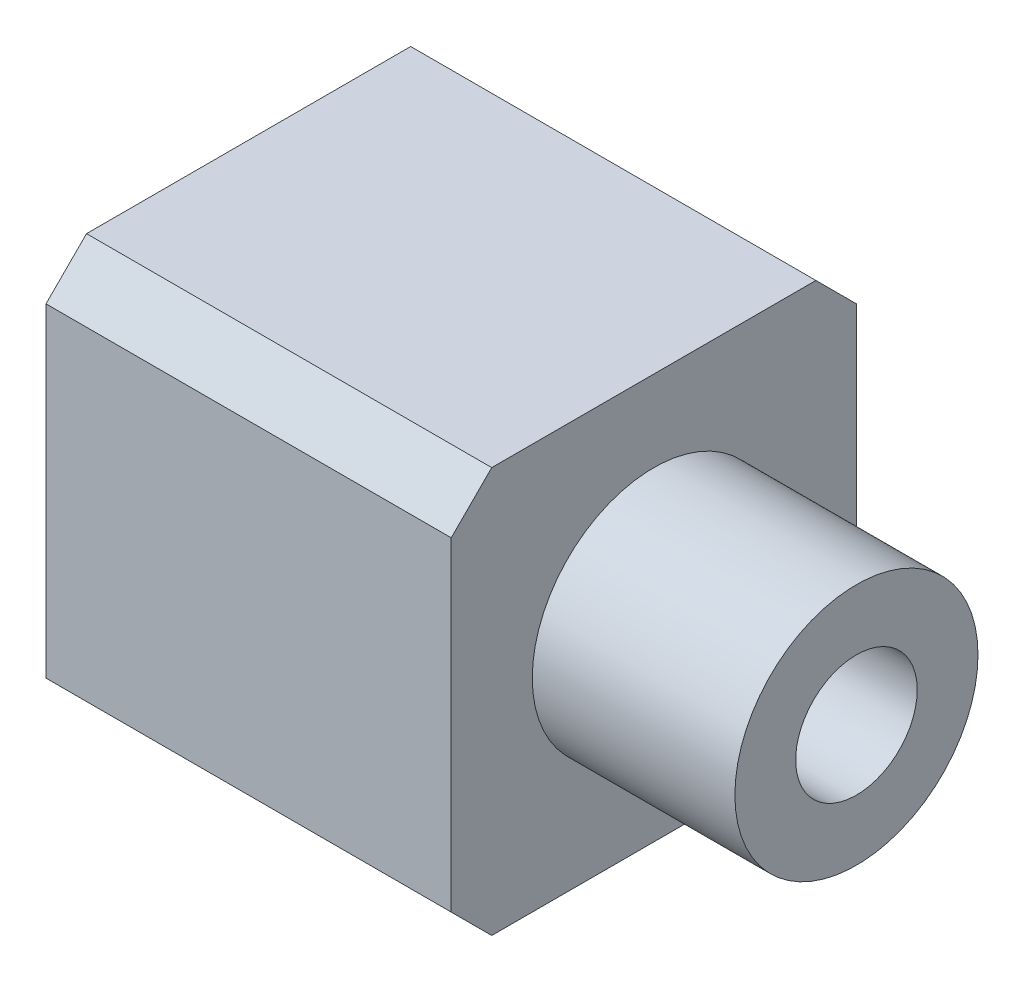
ISO-10303-21;
HEADER;
FILE_DESCRIPTION(('STEP AP214'),'2;1');
FILE_NAME('part.step','',(''),(''),'','','');
FILE_SCHEMA(('AUTOMOTIVE_DESIGN { 1 0 10303 214 1 1 1 1 }'));
ENDSEC;
DATA;
#1=APPLICATION_CONTEXT('core data for automotive mechanical design processes');
#2=APPLICATION_PROTOCOL_DEFINITION('international standard','automotive_design',2000,#1);
#3=PRODUCT_CONTEXT('',#1,'mechanical');
#4=PRODUCT('Part','Part','',(#3));
#5=PRODUCT_RELATED_PRODUCT_CATEGORY('part','',(#4));
#6=PRODUCT_DEFINITION_FORMATION('','',#4);
#7=PRODUCT_DEFINITION_CONTEXT('part definition',#1,'design');
#8=PRODUCT_DEFINITION('design','',#6,#7);
#9=PRODUCT_DEFINITION_SHAPE('','',#8);
#10=(LENGTH_UNIT() NAMED_UNIT(*) SI_UNIT(.MILLI.,.METRE.));
#11=(NAMED_UNIT(*) PLANE_ANGLE_UNIT() SI_UNIT($,.RADIAN.));
#12=(NAMED_UNIT(*) SI_UNIT($,.STERADIAN.) SOLID_ANGLE_UNIT());
#13=UNCERTAINTY_MEASURE_WITH_UNIT(LENGTH_MEASURE(1.E-05),#10,'distance_accuracy_value','');
#14=(GEOMETRIC_REPRESENTATION_CONTEXT(3) GLOBAL_UNCERTAINTY_ASSIGNED_CONTEXT((#13)) GLOBAL_UNIT_ASSIGNED_CONTEXT((#10,
#11,#12)) REPRESENTATION_CONTEXT('',''));
#15=CARTESIAN_POINT('',(0.,0.,0.));
#16=DIRECTION('',(0.,0.,1.));
#17=DIRECTION('',(1.,0.,0.));
#18=AXIS2_PLACEMENT_3D('',#15,#16,#17);
#19=CARTESIAN_POINT('',(-17.,-5.,5.));
#20=DIRECTION('',(0.,0.,1.));
#21=DIRECTION('',(1.,0.,0.));
#22=AXIS2_PLACEMENT_3D('',#19,#20,#21);
#23=PLANE('',#22);
#24=DIRECTION('',(0.,1.,0.));
#25=VECTOR('',#24,1.);
#26=CARTESIAN_POINT('',(-5.,-5.,5.));
#27=LINE('',#26,#25);
#28=CARTESIAN_POINT('',(-5.,-4.,5.));
#29=VERTEX_POINT('',#28);
#30=CARTESIAN_POINT('',(-5.,4.,5.));
#31=VERTEX_POINT('',#30);
#32=EDGE_CURVE('E131',#29,#31,#27,.T.);
#33=ORIENTED_EDGE('',*,*,#32,.T.);
#34=DIRECTION('',(-1.,0.,0.));
#35=VECTOR('',#34,1.);
#36=CARTESIAN_POINT('',(-17.,4.,5.));
#37=LINE('',#36,#35);
#38=CARTESIAN_POINT('',(-15.,4.,5.));
#39=VERTEX_POINT('',#38);
#40=EDGE_CURVE('E11',#31,#39,#37,.T.);
#41=ORIENTED_EDGE('',*,*,#40,.T.);
#42=DIRECTION('',(0.,-1.,0.));
#43=VECTOR('',#42,1.);
#44=CARTESIAN_POINT('',(-15.,-5.,5.));
#45=LINE('',#44,#43);
#46=CARTESIAN_POINT('',(-15.,-4.,5.));
#47=VERTEX_POINT('',#46);
#48=EDGE_CURVE('E132',#39,#47,#45,.T.);
#49=ORIENTED_EDGE('',*,*,#48,.T.);
#50=DIRECTION('',(1.,0.,0.));
#51=VECTOR('',#50,1.);
#52=CARTESIAN_POINT('',(-17.,-4.,5.));
#53=LINE('',#52,#51);
#54=EDGE_CURVE('E40',#47,#29,#53,.T.);
#55=ORIENTED_EDGE('',*,*,#54,.T.);
#56=EDGE_LOOP('',(#33,#41,#49,#55));
#57=FACE_BOUND('',#56,.T.);
#58=ADVANCED_FACE('F32',(#57),#23,.T.);
#59=CARTESIAN_POINT('',(-17.,5.,-5.));
#60=DIRECTION('',(0.,1.,0.));
#61=DIRECTION('',(0.,0.,1.));
#62=AXIS2_PLACEMENT_3D('',#59,#60,#61);
#63=PLANE('',#62);
#64=DIRECTION('',(0.,0.,1.));
#65=VECTOR('',#64,1.);
#66=CARTESIAN_POINT('',(-15.,5.,-5.));
#67=LINE('',#66,#65);
#68=CARTESIAN_POINT('',(-15.,5.,-4.));
#69=VERTEX_POINT('',#68);
#70=CARTESIAN_POINT('',(-15.,5.,4.));
#71=VERTEX_POINT('',#70);
#72=EDGE_CURVE('E167',#69,#71,#67,.T.);
#73=ORIENTED_EDGE('',*,*,#72,.T.);
#74=DIRECTION('',(1.,0.,0.));
#75=VECTOR('',#74,1.);
#76=CARTESIAN_POINT('',(-17.,5.,4.));
#77=LINE('',#76,#75);
#78=CARTESIAN_POINT('',(-5.,5.,4.));
#79=VERTEX_POINT('',#78);
#80=EDGE_CURVE('E128',#71,#79,#77,.T.);
#81=ORIENTED_EDGE('',*,*,#80,.T.);
#82=DIRECTION('',(0.,0.,-1.));
#83=VECTOR('',#82,1.);
#84=CARTESIAN_POINT('',(-5.,5.,-5.));
#85=LINE('',#84,#83);
#86=CARTESIAN_POINT('',(-5.,5.,-4.));
#87=VERTEX_POINT('',#86);
#88=EDGE_CURVE('E139',#79,#87,#85,.T.);
#89=ORIENTED_EDGE('',*,*,#88,.T.);
#90=DIRECTION('',(-1.,0.,0.));
#91=VECTOR('',#90,1.);
#92=CARTESIAN_POINT('',(-17.,5.,-4.));
#93=LINE('',#92,#91);
#94=EDGE_CURVE('E126',#87,#69,#93,.T.);
#95=ORIENTED_EDGE('',*,*,#94,.T.);
#96=EDGE_LOOP('',(#73,#81,#89,#95));
#97=FACE_BOUND('',#96,.T.);
#98=ADVANCED_FACE('F208',(#97),#63,.T.);
#99=CARTESIAN_POINT('',(-17.,-5.,-5.));
#100=DIRECTION('',(0.,0.,-1.));
#101=DIRECTION('',(-1.,0.,0.));
#102=AXIS2_PLACEMENT_3D('',#99,#100,#101);
#103=PLANE('',#102);
#104=CARTESIAN_POINT('',(-10.,0.,-5.));
#105=DIRECTION('',(0.,0.,-1.));
#106=DIRECTION('',(-1.,0.,0.));
#107=AXIS2_PLACEMENT_3D('',#104,#105,#106);
#108=CIRCLE('',#107,1.5);
#109=CARTESIAN_POINT('',(-11.5,0.,-5.));
#110=VERTEX_POINT('',#109);
#111=EDGE_CURVE('E193',#110,#110,#108,.T.);
#112=ORIENTED_EDGE('',*,*,#111,.F.);
#113=EDGE_LOOP('',(#112));
#114=FACE_BOUND('',#113,.T.);
#115=DIRECTION('',(0.,-1.,0.));
#116=VECTOR('',#115,1.);
#117=CARTESIAN_POINT('',(-5.,-5.,-5.));
#118=LINE('',#117,#116);
#119=CARTESIAN_POINT('',(-5.,4.00000000000001,-5.));
#120=VERTEX_POINT('',#119);
#121=CARTESIAN_POINT('',(-5.,-4.,-5.));
#122=VERTEX_POINT('',#121);
#123=EDGE_CURVE('E143',#120,#122,#118,.T.);
#124=ORIENTED_EDGE('',*,*,#123,.T.);
#125=DIRECTION('',(-1.,0.,0.));
#126=VECTOR('',#125,1.);
#127=CARTESIAN_POINT('',(-17.,-4.,-5.));
#128=LINE('',#127,#126);
#129=CARTESIAN_POINT('',(-15.,-4.,-5.));
#130=VERTEX_POINT('',#129);
#131=EDGE_CURVE('E121',#122,#130,#128,.T.);
#132=ORIENTED_EDGE('',*,*,#131,.T.);
#133=DIRECTION('',(0.,1.,0.));
#134=VECTOR('',#133,1.);
#135=CARTESIAN_POINT('',(-15.,-5.,-5.));
#136=LINE('',#135,#134);
#137=CARTESIAN_POINT('',(-15.,4.00000000000001,-5.));
#138=VERTEX_POINT('',#137);
#139=EDGE_CURVE('E161',#130,#138,#136,.T.);
#140=ORIENTED_EDGE('',*,*,#139,.T.);
#141=DIRECTION('',(1.,0.,0.));
#142=VECTOR('',#141,1.);
#143=CARTESIAN_POINT('',(-17.,4.00000000000001,-5.));
#144=LINE('',#143,#142);
#145=EDGE_CURVE('E154',#138,#120,#144,.T.);
#146=ORIENTED_EDGE('',*,*,#145,.T.);
#147=EDGE_LOOP('',(#124,#132,#140,#146));
#148=FACE_BOUND('',#147,.T.);
#149=ADVANCED_FACE('F160',(#114,#148),#103,.T.);
#150=CARTESIAN_POINT('',(-17.,-5.,-5.));
#151=DIRECTION('',(0.,-1.,0.));
#152=DIRECTION('',(0.,0.,-1.));
#153=AXIS2_PLACEMENT_3D('',#150,#151,#152);
#154=PLANE('',#153);
#155=DIRECTION('',(0.,0.,-1.));
#156=VECTOR('',#155,1.);
#157=CARTESIAN_POINT('',(-15.,-5.,-5.));
#158=LINE('',#157,#156);
#159=CARTESIAN_POINT('',(-15.,-5.,3.99999999999999));
#160=VERTEX_POINT('',#159);
#161=CARTESIAN_POINT('',(-15.,-5.,-4.));
#162=VERTEX_POINT('',#161);
#163=EDGE_CURVE('E101',#160,#162,#158,.T.);
#164=ORIENTED_EDGE('',*,*,#163,.T.);
#165=DIRECTION('',(1.,0.,0.));
#166=VECTOR('',#165,1.);
#167=CARTESIAN_POINT('',(-17.,-5.,-4.));
#168=LINE('',#167,#166);
#169=CARTESIAN_POINT('',(-5.,-5.,-4.));
#170=VERTEX_POINT('',#169);
#171=EDGE_CURVE('E106',#162,#170,#168,.T.);
#172=ORIENTED_EDGE('',*,*,#171,.T.);
#173=DIRECTION('',(0.,0.,1.));
#174=VECTOR('',#173,1.);
#175=CARTESIAN_POINT('',(-5.,-5.,-5.));
#176=LINE('',#175,#174);
#177=CARTESIAN_POINT('',(-5.,-5.,3.99999999999999));
#178=VERTEX_POINT('',#177);
#179=EDGE_CURVE('E104',#170,#178,#176,.T.);
#180=ORIENTED_EDGE('',*,*,#179,.T.);
#181=DIRECTION('',(-1.,0.,0.));
#182=VECTOR('',#181,1.);
#183=CARTESIAN_POINT('',(-17.,-5.,3.99999999999999));
#184=LINE('',#183,#182);
#185=EDGE_CURVE('E98',#178,#160,#184,.T.);
#186=ORIENTED_EDGE('',*,*,#185,.T.);
#187=EDGE_LOOP('',(#164,#172,#180,#186));
#188=FACE_BOUND('',#187,.T.);
#189=ADVANCED_FACE('F99',(#188),#154,.T.);
#190=CARTESIAN_POINT('',(-5.,0.,0.));
#191=DIRECTION('',(1.,0.,0.));
#192=DIRECTION('',(0.,0.,-1.));
#193=AXIS2_PLACEMENT_3D('',#190,#191,#192);
#194=PLANE('',#193);
#195=ORIENTED_EDGE('',*,*,#179,.F.);
#196=DIRECTION('',(0.,-0.707106781186548,0.707106781186548));
#197=VECTOR('',#196,1.);
#198=CARTESIAN_POINT('',(-5.,-4.5,-4.5));
#199=LINE('',#198,#197);
#200=EDGE_CURVE('E152',#170,#122,#199,.F.);
#201=ORIENTED_EDGE('',*,*,#200,.T.);
#202=ORIENTED_EDGE('',*,*,#123,.F.);
#203=DIRECTION('',(0.,-0.707106781186545,-0.70710678118655));
#204=VECTOR('',#203,1.);
#205=CARTESIAN_POINT('',(-5.,4.50000000000002,-4.49999999999998));
#206=LINE('',#205,#204);
#207=EDGE_CURVE('E148',#120,#87,#206,.F.);
#208=ORIENTED_EDGE('',*,*,#207,.T.);
#209=ORIENTED_EDGE('',*,*,#88,.F.);
#210=DIRECTION('',(0.,0.707106781186549,-0.707106781186546));
#211=VECTOR('',#210,1.);
#212=CARTESIAN_POINT('',(-5.,4.49999999999999,4.50000000000001));
#213=LINE('',#212,#211);
#214=EDGE_CURVE('E138',#79,#31,#213,.F.);
#215=ORIENTED_EDGE('',*,*,#214,.T.);
#216=ORIENTED_EDGE('',*,*,#32,.F.);
#217=DIRECTION('',(0.,0.707106781186545,0.70710678118655));
#218=VECTOR('',#217,1.);
#219=CARTESIAN_POINT('',(-5.,-4.50000000000001,4.49999999999998));
#220=LINE('',#219,#218);
#221=EDGE_CURVE('E136',#29,#178,#220,.F.);
#222=ORIENTED_EDGE('',*,*,#221,.T.);
#223=EDGE_LOOP('',(#195,#201,#202,#208,#209,#215,#216,#222));
#224=FACE_BOUND('',#223,.T.);
#225=CARTESIAN_POINT('',(-5.,0.,0.));
#226=DIRECTION('',(1.,0.,0.));
#227=DIRECTION('',(0.,0.,-1.));
#228=AXIS2_PLACEMENT_3D('',#225,#226,#227);
#229=CIRCLE('',#228,3.);
#230=CARTESIAN_POINT('',(-5.,0.,-3.));
#231=VERTEX_POINT('',#230);
#232=EDGE_CURVE('E171',#231,#231,#229,.T.);
#233=ORIENTED_EDGE('',*,*,#232,.F.);
#234=EDGE_LOOP('',(#233));
#235=FACE_BOUND('',#234,.T.);
#236=ADVANCED_FACE('F134',(#224,#235),#194,.T.);
#237=CARTESIAN_POINT('',(-5.,0.,0.));
#238=DIRECTION('',(1.,0.,0.));
#239=DIRECTION('',(0.,0.,-1.));
#240=AXIS2_PLACEMENT_3D('',#237,#238,#239);
#241=CYLINDRICAL_SURFACE('',#240,3.);
#242=ORIENTED_EDGE('',*,*,#232,.T.);
#243=EDGE_LOOP('',(#242));
#244=FACE_BOUND('',#243,.T.);
#245=CARTESIAN_POINT('',(0.,0.,0.));
#246=DIRECTION('',(1.,0.,0.));
#247=DIRECTION('',(0.,0.,-1.));
#248=AXIS2_PLACEMENT_3D('',#245,#246,#247);
#249=CIRCLE('',#248,3.);
#250=CARTESIAN_POINT('',(0.,0.,-3.));
#251=VERTEX_POINT('',#250);
#252=EDGE_CURVE('E173',#251,#251,#249,.T.);
#253=ORIENTED_EDGE('',*,*,#252,.F.);
#254=EDGE_LOOP('',(#253));
#255=FACE_BOUND('',#254,.T.);
#256=ADVANCED_FACE('F326',(#244,#255),#241,.T.);
#257=CARTESIAN_POINT('',(0.,0.,0.));
#258=DIRECTION('',(1.,0.,0.));
#259=DIRECTION('',(0.,0.,-1.));
#260=AXIS2_PLACEMENT_3D('',#257,#258,#259);
#261=PLANE('',#260);
#262=CARTESIAN_POINT('',(0.,0.,0.));
#263=DIRECTION('',(1.,0.,0.));
#264=DIRECTION('',(0.,0.,-1.));
#265=AXIS2_PLACEMENT_3D('',#262,#263,#264);
#266=CIRCLE('',#265,1.5);
#267=CARTESIAN_POINT('',(0.,0.,-1.5));
#268=VERTEX_POINT('',#267);
#269=EDGE_CURVE('E187',#268,#268,#266,.T.);
#270=ORIENTED_EDGE('',*,*,#269,.F.);
#271=EDGE_LOOP('',(#270));
#272=FACE_BOUND('',#271,.T.);
#273=ORIENTED_EDGE('',*,*,#252,.T.);
#274=EDGE_LOOP('',(#273));
#275=FACE_BOUND('',#274,.T.);
#276=ADVANCED_FACE('F297',(#272,#275),#261,.T.);
#277=CARTESIAN_POINT('',(-15.,0.,0.));
#278=DIRECTION('',(-1.,0.,0.));
#279=DIRECTION('',(0.,0.,1.));
#280=AXIS2_PLACEMENT_3D('',#277,#278,#279);
#281=PLANE('',#280);
#282=ORIENTED_EDGE('',*,*,#139,.F.);
#283=DIRECTION('',(0.,0.707106781186548,-0.707106781186548));
#284=VECTOR('',#283,1.);
#285=CARTESIAN_POINT('',(-15.,-4.5,-4.5));
#286=LINE('',#285,#284);
#287=EDGE_CURVE('E112',#130,#162,#286,.F.);
#288=ORIENTED_EDGE('',*,*,#287,.T.);
#289=ORIENTED_EDGE('',*,*,#163,.F.);
#290=DIRECTION('',(0.,-0.707106781186545,-0.70710678118655));
#291=VECTOR('',#290,1.);
#292=CARTESIAN_POINT('',(-15.,-4.50000000000001,4.49999999999998));
#293=LINE('',#292,#291);
#294=EDGE_CURVE('E47',#160,#47,#293,.F.);
#295=ORIENTED_EDGE('',*,*,#294,.T.);
#296=ORIENTED_EDGE('',*,*,#48,.F.);
#297=DIRECTION('',(0.,-0.707106781186549,0.707106781186546));
#298=VECTOR('',#297,1.);
#299=CARTESIAN_POINT('',(-15.,4.49999999999999,4.50000000000001));
#300=LINE('',#299,#298);
#301=EDGE_CURVE('E117',#39,#71,#300,.F.);
#302=ORIENTED_EDGE('',*,*,#301,.T.);
#303=ORIENTED_EDGE('',*,*,#72,.F.);
#304=DIRECTION('',(0.,0.707106781186545,0.70710678118655));
#305=VECTOR('',#304,1.);
#306=CARTESIAN_POINT('',(-15.,4.50000000000002,-4.49999999999998));
#307=LINE('',#306,#305);
#308=EDGE_CURVE('E118',#69,#138,#307,.F.);
#309=ORIENTED_EDGE('',*,*,#308,.T.);
#310=EDGE_LOOP('',(#282,#288,#289,#295,#296,#302,#303,#309));
#311=FACE_BOUND('',#310,.T.);
#312=CARTESIAN_POINT('',(-15.,0.,0.));
#313=DIRECTION('',(-1.,0.,0.));
#314=DIRECTION('',(0.,0.,1.));
#315=AXIS2_PLACEMENT_3D('',#312,#313,#314);
#316=CIRCLE('',#315,3.);
#317=CARTESIAN_POINT('',(-15.,0.,3.));
#318=VERTEX_POINT('',#317);
#319=EDGE_CURVE('E168',#318,#318,#316,.T.);
#320=ORIENTED_EDGE('',*,*,#319,.F.);
#321=EDGE_LOOP('',(#320));
#322=FACE_BOUND('',#321,.T.);
#323=ADVANCED_FACE('F109',(#311,#322),#281,.T.);
#324=CARTESIAN_POINT('',(-15.,0.,0.));
#325=DIRECTION('',(-1.,0.,0.));
#326=DIRECTION('',(0.,0.,1.));
#327=AXIS2_PLACEMENT_3D('',#324,#325,#326);
#328=CYLINDRICAL_SURFACE('',#327,3.);
#329=ORIENTED_EDGE('',*,*,#319,.T.);
#330=EDGE_LOOP('',(#329));
#331=FACE_BOUND('',#330,.T.);
#332=CARTESIAN_POINT('',(-17.,0.,0.));
#333=DIRECTION('',(-1.,0.,0.));
#334=DIRECTION('',(0.,0.,1.));
#335=AXIS2_PLACEMENT_3D('',#332,#333,#334);
#336=CIRCLE('',#335,3.);
#337=CARTESIAN_POINT('',(-17.,0.,3.));
#338=VERTEX_POINT('',#337);
#339=EDGE_CURVE('E181',#338,#338,#336,.T.);
#340=ORIENTED_EDGE('',*,*,#339,.F.);
#341=EDGE_LOOP('',(#340));
#342=FACE_BOUND('',#341,.T.);
#343=ADVANCED_FACE('F282',(#331,#342),#328,.T.);
#344=CARTESIAN_POINT('',(-17.,0.,0.));
#345=DIRECTION('',(1.,0.,0.));
#346=DIRECTION('',(0.,0.,-1.));
#347=AXIS2_PLACEMENT_3D('',#344,#345,#346);
#348=PLANE('',#347);
#349=CARTESIAN_POINT('',(-17.,0.,0.));
#350=DIRECTION('',(1.,0.,0.));
#351=DIRECTION('',(0.,0.,-1.));
#352=AXIS2_PLACEMENT_3D('',#349,#350,#351);
#353=CIRCLE('',#352,1.5);
#354=CARTESIAN_POINT('',(-17.,0.,-1.5));
#355=VERTEX_POINT('',#354);
#356=EDGE_CURVE('E184',#355,#355,#353,.T.);
#357=ORIENTED_EDGE('',*,*,#356,.T.);
#358=EDGE_LOOP('',(#357));
#359=FACE_BOUND('',#358,.T.);
#360=ORIENTED_EDGE('',*,*,#339,.T.);
#361=EDGE_LOOP('',(#360));
#362=FACE_BOUND('',#361,.T.);
#363=ADVANCED_FACE('F277',(#359,#362),#348,.F.);
#364=CARTESIAN_POINT('',(-17.,0.,0.));
#365=DIRECTION('',(1.,0.,0.));
#366=DIRECTION('',(0.,0.,-1.));
#367=AXIS2_PLACEMENT_3D('',#364,#365,#366);
#368=CYLINDRICAL_SURFACE('',#367,1.5);
#369=ORIENTED_EDGE('',*,*,#356,.F.);
#370=EDGE_LOOP('',(#369));
#371=FACE_BOUND('',#370,.T.);
#372=ORIENTED_EDGE('',*,*,#269,.T.);
#373=EDGE_LOOP('',(#372));
#374=FACE_BOUND('',#373,.T.);
#375=ADVANCED_FACE('F225',(#371,#374),#368,.F.);
#376=CARTESIAN_POINT('',(-17.,-5.,-4.));
#377=DIRECTION('',(0.,0.707106781186547,0.707106781186547));
#378=DIRECTION('',(1.,0.,0.));
#379=AXIS2_PLACEMENT_3D('',#376,#377,#378);
#380=PLANE('',#379);
#381=ORIENTED_EDGE('',*,*,#287,.F.);
#382=ORIENTED_EDGE('',*,*,#131,.F.);
#383=ORIENTED_EDGE('',*,*,#200,.F.);
#384=ORIENTED_EDGE('',*,*,#171,.F.);
#385=EDGE_LOOP('',(#381,#382,#383,#384));
#386=FACE_BOUND('',#385,.T.);
#387=ADVANCED_FACE('F170',(#386),#380,.F.);
#388=CARTESIAN_POINT('',(-17.,5.,4.));
#389=DIRECTION('',(0.,-0.707106781186546,-0.707106781186549));
#390=DIRECTION('',(1.,0.,0.));
#391=AXIS2_PLACEMENT_3D('',#388,#389,#390);
#392=PLANE('',#391);
#393=ORIENTED_EDGE('',*,*,#301,.F.);
#394=ORIENTED_EDGE('',*,*,#40,.F.);
#395=ORIENTED_EDGE('',*,*,#214,.F.);
#396=ORIENTED_EDGE('',*,*,#80,.F.);
#397=EDGE_LOOP('',(#393,#394,#395,#396));
#398=FACE_BOUND('',#397,.T.);
#399=ADVANCED_FACE('F224',(#398),#392,.F.);
#400=CARTESIAN_POINT('',(-17.,-4.,5.));
#401=DIRECTION('',(0.,0.70710678118655,-0.707106781186545));
#402=DIRECTION('',(1.,0.,0.));
#403=AXIS2_PLACEMENT_3D('',#400,#401,#402);
#404=PLANE('',#403);
#405=ORIENTED_EDGE('',*,*,#294,.F.);
#406=ORIENTED_EDGE('',*,*,#185,.F.);
#407=ORIENTED_EDGE('',*,*,#221,.F.);
#408=ORIENTED_EDGE('',*,*,#54,.F.);
#409=EDGE_LOOP('',(#405,#406,#407,#408));
#410=FACE_BOUND('',#409,.T.);
#411=ADVANCED_FACE('F115',(#410),#404,.F.);
#412=CARTESIAN_POINT('',(-17.,4.00000000000001,-5.));
#413=DIRECTION('',(0.,-0.70710678118655,0.707106781186545));
#414=DIRECTION('',(1.,0.,0.));
#415=AXIS2_PLACEMENT_3D('',#412,#413,#414);
#416=PLANE('',#415);
#417=ORIENTED_EDGE('',*,*,#308,.F.);
#418=ORIENTED_EDGE('',*,*,#94,.F.);
#419=ORIENTED_EDGE('',*,*,#207,.F.);
#420=ORIENTED_EDGE('',*,*,#145,.F.);
#421=EDGE_LOOP('',(#417,#418,#419,#420));
#422=FACE_BOUND('',#421,.T.);
#423=ADVANCED_FACE('F34',(#422),#416,.F.);
#424=CARTESIAN_POINT('',(-10.,0.,-3.));
#425=DIRECTION('',(0.,0.,-1.));
#426=DIRECTION('',(-1.,0.,0.));
#427=AXIS2_PLACEMENT_3D('',#424,#425,#426);
#428=CYLINDRICAL_SURFACE('',#427,1.5);
#429=CARTESIAN_POINT('',(-10.,0.,-3.));
#430=DIRECTION('',(0.,0.,-1.));
#431=DIRECTION('',(-1.,0.,0.));
#432=AXIS2_PLACEMENT_3D('',#429,#430,#431);
#433=CIRCLE('',#432,1.5);
#434=CARTESIAN_POINT('',(-11.5,0.,-3.));
#435=VERTEX_POINT('',#434);
#436=EDGE_CURVE('E190',#435,#435,#433,.T.);
#437=ORIENTED_EDGE('',*,*,#436,.F.);
#438=EDGE_LOOP('',(#437));
#439=FACE_BOUND('',#438,.T.);
#440=ORIENTED_EDGE('',*,*,#111,.T.);
#441=EDGE_LOOP('',(#440));
#442=FACE_BOUND('',#441,.T.);
#443=ADVANCED_FACE('F201',(#439,#442),#428,.F.);
#444=CARTESIAN_POINT('',(-10.,0.,-3.));
#445=DIRECTION('',(0.,0.,-1.));
#446=DIRECTION('',(-1.,0.,0.));
#447=AXIS2_PLACEMENT_3D('',#444,#445,#446);
#448=PLANE('',#447);
#449=ORIENTED_EDGE('',*,*,#436,.T.);
#450=EDGE_LOOP('',(#449));
#451=FACE_BOUND('',#450,.T.);
#452=ADVANCED_FACE('F199',(#451),#448,.T.);
#453=CLOSED_SHELL('',(#58,#98,#149,#189,#236,#256,#276,#323,#343,#363,#375,#387,#399,#411,#423,
#443,#452));
#454=MANIFOLD_SOLID_BREP('B2',#453);
#455=ADVANCED_BREP_SHAPE_REPRESENTATION('',(#18,#454),#14);
#456=SHAPE_DEFINITION_REPRESENTATION(#9,#455);
ENDSEC;
END-ISO-10303-21;
